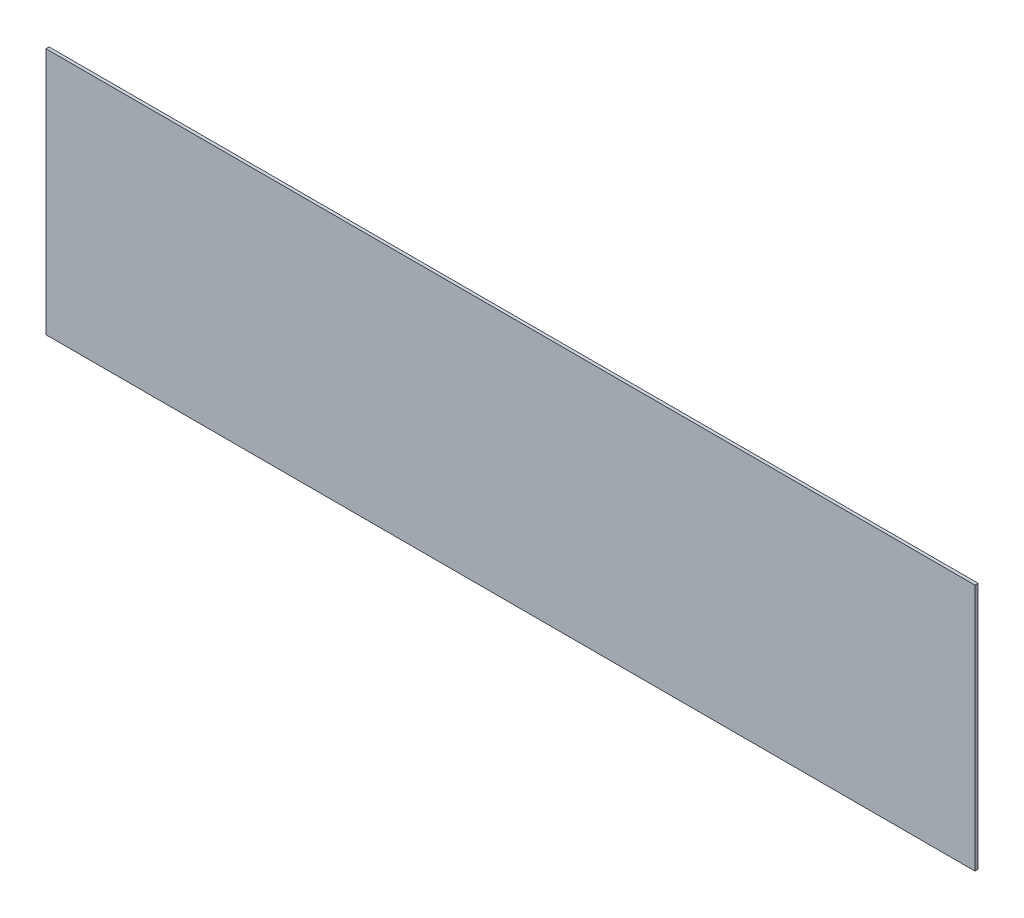
ISO-10303-21;
HEADER;
FILE_DESCRIPTION(('STEP AP214'),'2;1');
FILE_NAME('part.step','',(''),(''),'','','');
FILE_SCHEMA(('AUTOMOTIVE_DESIGN { 1 0 10303 214 1 1 1 1 }'));
ENDSEC;
DATA;
#1=APPLICATION_CONTEXT('core data for automotive mechanical design processes');
#2=APPLICATION_PROTOCOL_DEFINITION('international standard','automotive_design',2000,#1);
#3=PRODUCT_CONTEXT('',#1,'mechanical');
#4=PRODUCT('Part','Part','',(#3));
#5=PRODUCT_RELATED_PRODUCT_CATEGORY('part','',(#4));
#6=PRODUCT_DEFINITION_FORMATION('','',#4);
#7=PRODUCT_DEFINITION_CONTEXT('part definition',#1,'design');
#8=PRODUCT_DEFINITION('design','',#6,#7);
#9=PRODUCT_DEFINITION_SHAPE('','',#8);
#10=(LENGTH_UNIT() NAMED_UNIT(*) SI_UNIT(.MILLI.,.METRE.));
#11=(NAMED_UNIT(*) PLANE_ANGLE_UNIT() SI_UNIT($,.RADIAN.));
#12=(NAMED_UNIT(*) SI_UNIT($,.STERADIAN.) SOLID_ANGLE_UNIT());
#13=UNCERTAINTY_MEASURE_WITH_UNIT(LENGTH_MEASURE(1.E-05),#10,'distance_accuracy_value','');
#14=(GEOMETRIC_REPRESENTATION_CONTEXT(3) GLOBAL_UNCERTAINTY_ASSIGNED_CONTEXT((#13)) GLOBAL_UNIT_ASSIGNED_CONTEXT((#10,
#11,#12)) REPRESENTATION_CONTEXT('',''));
#15=CARTESIAN_POINT('',(0.,0.,0.));
#16=DIRECTION('',(0.,0.,1.));
#17=DIRECTION('',(1.,0.,0.));
#18=AXIS2_PLACEMENT_3D('',#15,#16,#17);
#19=CARTESIAN_POINT('',(50.,130.,-250.));
#20=DIRECTION('',(-1.,0.,0.));
#21=DIRECTION('',(0.,0.,1.));
#22=AXIS2_PLACEMENT_3D('',#19,#20,#21);
#23=PLANE('',#22);
#24=DIRECTION('',(0.,-1.,0.));
#25=VECTOR('',#24,1.);
#26=CARTESIAN_POINT('',(50.,130.,-248.));
#27=LINE('',#26,#25);
#28=CARTESIAN_POINT('',(50.,290.,-248.));
#29=VERTEX_POINT('',#28);
#30=CARTESIAN_POINT('',(50.,130.,-248.));
#31=VERTEX_POINT('',#30);
#32=EDGE_CURVE('E103',#29,#31,#27,.T.);
#33=ORIENTED_EDGE('',*,*,#32,.F.);
#34=DIRECTION('',(0.,0.,1.));
#35=VECTOR('',#34,1.);
#36=CARTESIAN_POINT('',(50.,290.,-250.));
#37=LINE('',#36,#35);
#38=CARTESIAN_POINT('',(50.,290.,-250.));
#39=VERTEX_POINT('',#38);
#40=EDGE_CURVE('E11',#39,#29,#37,.T.);
#41=ORIENTED_EDGE('',*,*,#40,.F.);
#42=DIRECTION('',(0.,-1.,0.));
#43=VECTOR('',#42,1.);
#44=CARTESIAN_POINT('',(50.,130.,-250.));
#45=LINE('',#44,#43);
#46=CARTESIAN_POINT('',(50.,130.,-250.));
#47=VERTEX_POINT('',#46);
#48=EDGE_CURVE('E97',#39,#47,#45,.T.);
#49=ORIENTED_EDGE('',*,*,#48,.T.);
#50=DIRECTION('',(0.,0.,1.));
#51=VECTOR('',#50,1.);
#52=CARTESIAN_POINT('',(50.,130.,-250.));
#53=LINE('',#52,#51);
#54=EDGE_CURVE('E42',#47,#31,#53,.T.);
#55=ORIENTED_EDGE('',*,*,#54,.T.);
#56=EDGE_LOOP('',(#33,#41,#49,#55));
#57=FACE_BOUND('',#56,.T.);
#58=ADVANCED_FACE('F39',(#57),#23,.T.);
#59=CARTESIAN_POINT('',(50.,290.,-250.));
#60=DIRECTION('',(0.,1.,0.));
#61=DIRECTION('',(0.,0.,1.));
#62=AXIS2_PLACEMENT_3D('',#59,#60,#61);
#63=PLANE('',#62);
#64=DIRECTION('',(-1.,0.,0.));
#65=VECTOR('',#64,1.);
#66=CARTESIAN_POINT('',(50.,290.,-248.));
#67=LINE('',#66,#65);
#68=CARTESIAN_POINT('',(650.,290.,-248.));
#69=VERTEX_POINT('',#68);
#70=EDGE_CURVE('E99',#69,#29,#67,.T.);
#71=ORIENTED_EDGE('',*,*,#70,.F.);
#72=DIRECTION('',(0.,0.,1.));
#73=VECTOR('',#72,1.);
#74=CARTESIAN_POINT('',(650.,290.,-250.));
#75=LINE('',#74,#73);
#76=CARTESIAN_POINT('',(650.,290.,-250.));
#77=VERTEX_POINT('',#76);
#78=EDGE_CURVE('E48',#77,#69,#75,.T.);
#79=ORIENTED_EDGE('',*,*,#78,.F.);
#80=DIRECTION('',(-1.,0.,0.));
#81=VECTOR('',#80,1.);
#82=CARTESIAN_POINT('',(50.,290.,-250.));
#83=LINE('',#82,#81);
#84=EDGE_CURVE('E94',#77,#39,#83,.T.);
#85=ORIENTED_EDGE('',*,*,#84,.T.);
#86=ORIENTED_EDGE('',*,*,#40,.T.);
#87=EDGE_LOOP('',(#71,#79,#85,#86));
#88=FACE_BOUND('',#87,.T.);
#89=ADVANCED_FACE('F113',(#88),#63,.T.);
#90=CARTESIAN_POINT('',(650.,130.,-250.));
#91=DIRECTION('',(1.,0.,0.));
#92=DIRECTION('',(0.,0.,-1.));
#93=AXIS2_PLACEMENT_3D('',#90,#91,#92);
#94=PLANE('',#93);
#95=DIRECTION('',(0.,1.,0.));
#96=VECTOR('',#95,1.);
#97=CARTESIAN_POINT('',(650.,130.,-248.));
#98=LINE('',#97,#96);
#99=CARTESIAN_POINT('',(650.,130.,-248.));
#100=VERTEX_POINT('',#99);
#101=EDGE_CURVE('E89',#100,#69,#98,.T.);
#102=ORIENTED_EDGE('',*,*,#101,.F.);
#103=DIRECTION('',(0.,0.,1.));
#104=VECTOR('',#103,1.);
#105=CARTESIAN_POINT('',(650.,130.,-250.));
#106=LINE('',#105,#104);
#107=CARTESIAN_POINT('',(650.,130.,-250.));
#108=VERTEX_POINT('',#107);
#109=EDGE_CURVE('E84',#108,#100,#106,.T.);
#110=ORIENTED_EDGE('',*,*,#109,.F.);
#111=DIRECTION('',(0.,1.,0.));
#112=VECTOR('',#111,1.);
#113=CARTESIAN_POINT('',(650.,130.,-250.));
#114=LINE('',#113,#112);
#115=EDGE_CURVE('E87',#108,#77,#114,.T.);
#116=ORIENTED_EDGE('',*,*,#115,.T.);
#117=ORIENTED_EDGE('',*,*,#78,.T.);
#118=EDGE_LOOP('',(#102,#110,#116,#117));
#119=FACE_BOUND('',#118,.T.);
#120=ADVANCED_FACE('F86',(#119),#94,.T.);
#121=CARTESIAN_POINT('',(50.,130.,-250.));
#122=DIRECTION('',(0.,-1.,0.));
#123=DIRECTION('',(0.,0.,-1.));
#124=AXIS2_PLACEMENT_3D('',#121,#122,#123);
#125=PLANE('',#124);
#126=DIRECTION('',(1.,0.,0.));
#127=VECTOR('',#126,1.);
#128=CARTESIAN_POINT('',(50.,130.,-248.));
#129=LINE('',#128,#127);
#130=EDGE_CURVE('E106',#31,#100,#129,.T.);
#131=ORIENTED_EDGE('',*,*,#130,.F.);
#132=ORIENTED_EDGE('',*,*,#54,.F.);
#133=DIRECTION('',(1.,0.,0.));
#134=VECTOR('',#133,1.);
#135=CARTESIAN_POINT('',(50.,130.,-250.));
#136=LINE('',#135,#134);
#137=EDGE_CURVE('E93',#47,#108,#136,.T.);
#138=ORIENTED_EDGE('',*,*,#137,.T.);
#139=ORIENTED_EDGE('',*,*,#109,.T.);
#140=EDGE_LOOP('',(#131,#132,#138,#139));
#141=FACE_BOUND('',#140,.T.);
#142=ADVANCED_FACE('F96',(#141),#125,.T.);
#143=CARTESIAN_POINT('',(0.,0.,-250.));
#144=DIRECTION('',(0.,0.,-1.));
#145=DIRECTION('',(-1.,0.,0.));
#146=AXIS2_PLACEMENT_3D('',#143,#144,#145);
#147=PLANE('',#146);
#148=ORIENTED_EDGE('',*,*,#48,.F.);
#149=ORIENTED_EDGE('',*,*,#84,.F.);
#150=ORIENTED_EDGE('',*,*,#115,.F.);
#151=ORIENTED_EDGE('',*,*,#137,.F.);
#152=EDGE_LOOP('',(#148,#149,#150,#151));
#153=FACE_BOUND('',#152,.T.);
#154=ADVANCED_FACE('F92',(#153),#147,.T.);
#155=CARTESIAN_POINT('',(0.,0.,-248.));
#156=DIRECTION('',(0.,0.,-1.));
#157=DIRECTION('',(-1.,0.,0.));
#158=AXIS2_PLACEMENT_3D('',#155,#156,#157);
#159=PLANE('',#158);
#160=ORIENTED_EDGE('',*,*,#32,.T.);
#161=ORIENTED_EDGE('',*,*,#130,.T.);
#162=ORIENTED_EDGE('',*,*,#101,.T.);
#163=ORIENTED_EDGE('',*,*,#70,.T.);
#164=EDGE_LOOP('',(#160,#161,#162,#163));
#165=FACE_BOUND('',#164,.T.);
#166=ADVANCED_FACE('F112',(#165),#159,.F.);
#167=CLOSED_SHELL('',(#58,#89,#120,#142,#154,#166));
#168=MANIFOLD_SOLID_BREP('B2',#167);
#169=ADVANCED_BREP_SHAPE_REPRESENTATION('',(#18,#168),#14);
#170=SHAPE_DEFINITION_REPRESENTATION(#9,#169);
ENDSEC;
END-ISO-10303-21;
